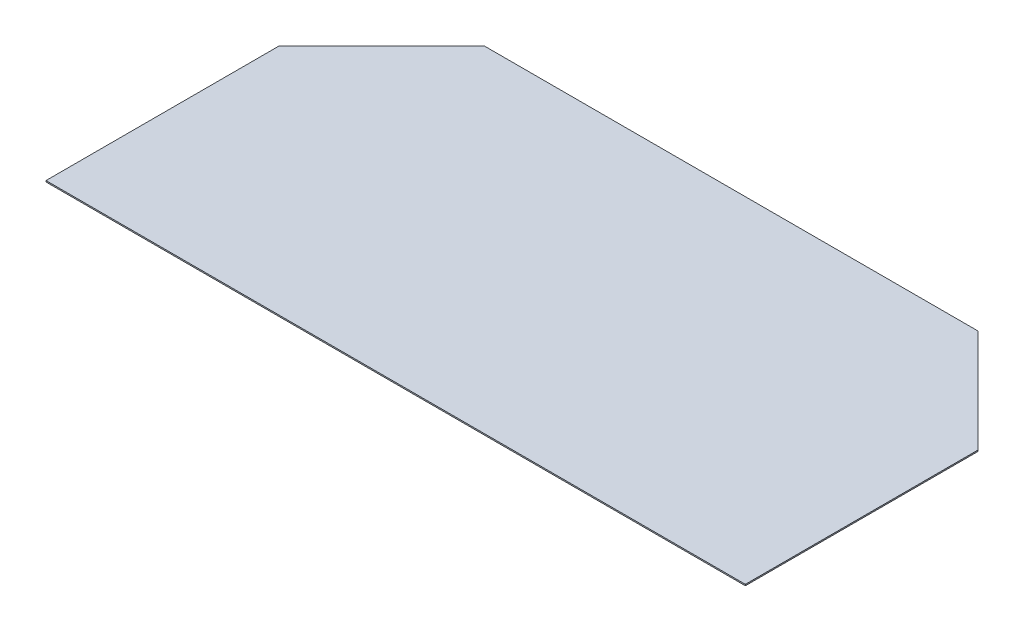
ISO-10303-21;
HEADER;
FILE_DESCRIPTION(('STEP AP214'),'2;1');
FILE_NAME('part.step','',(''),(''),'','','');
FILE_SCHEMA(('AUTOMOTIVE_DESIGN { 1 0 10303 214 1 1 1 1 }'));
ENDSEC;
DATA;
#1=APPLICATION_CONTEXT('core data for automotive mechanical design processes');
#2=APPLICATION_PROTOCOL_DEFINITION('international standard','automotive_design',2000,#1);
#3=PRODUCT_CONTEXT('',#1,'mechanical');
#4=PRODUCT('Part','Part','',(#3));
#5=PRODUCT_RELATED_PRODUCT_CATEGORY('part','',(#4));
#6=PRODUCT_DEFINITION_FORMATION('','',#4);
#7=PRODUCT_DEFINITION_CONTEXT('part definition',#1,'design');
#8=PRODUCT_DEFINITION('design','',#6,#7);
#9=PRODUCT_DEFINITION_SHAPE('','',#8);
#10=(LENGTH_UNIT() NAMED_UNIT(*) SI_UNIT(.MILLI.,.METRE.));
#11=(NAMED_UNIT(*) PLANE_ANGLE_UNIT() SI_UNIT($,.RADIAN.));
#12=(NAMED_UNIT(*) SI_UNIT($,.STERADIAN.) SOLID_ANGLE_UNIT());
#13=UNCERTAINTY_MEASURE_WITH_UNIT(LENGTH_MEASURE(1.E-05),#10,'distance_accuracy_value','');
#14=(GEOMETRIC_REPRESENTATION_CONTEXT(3) GLOBAL_UNCERTAINTY_ASSIGNED_CONTEXT((#13)) GLOBAL_UNIT_ASSIGNED_CONTEXT((#10,
#11,#12)) REPRESENTATION_CONTEXT('',''));
#15=CARTESIAN_POINT('',(0.,0.,0.));
#16=DIRECTION('',(0.,0.,1.));
#17=DIRECTION('',(1.,0.,0.));
#18=AXIS2_PLACEMENT_3D('',#15,#16,#17);
#19=CARTESIAN_POINT('',(0.,0.23,-41.58));
#20=DIRECTION('',(1.,0.,0.));
#21=DIRECTION('',(0.,0.,-1.));
#22=AXIS2_PLACEMENT_3D('',#19,#20,#21);
#23=PLANE('',#22);
#24=DIRECTION('',(0.,0.,1.));
#25=VECTOR('',#24,1.);
#26=CARTESIAN_POINT('',(0.,0.,-41.58));
#27=LINE('',#26,#25);
#28=CARTESIAN_POINT('',(0.,0.,-41.58));
#29=VERTEX_POINT('',#28);
#30=CARTESIAN_POINT('',(0.,0.,0.));
#31=VERTEX_POINT('',#30);
#32=EDGE_CURVE('E125',#29,#31,#27,.T.);
#33=ORIENTED_EDGE('',*,*,#32,.T.);
#34=DIRECTION('',(0.,-1.,0.));
#35=VECTOR('',#34,1.);
#36=CARTESIAN_POINT('',(0.,0.23,0.));
#37=LINE('',#36,#35);
#38=CARTESIAN_POINT('',(0.,0.23,0.));
#39=VERTEX_POINT('',#38);
#40=EDGE_CURVE('E11',#39,#31,#37,.T.);
#41=ORIENTED_EDGE('',*,*,#40,.F.);
#42=DIRECTION('',(0.,0.,1.));
#43=VECTOR('',#42,1.);
#44=CARTESIAN_POINT('',(0.,0.23,-41.58));
#45=LINE('',#44,#43);
#46=CARTESIAN_POINT('',(0.,0.23,-41.58));
#47=VERTEX_POINT('',#46);
#48=EDGE_CURVE('E135',#47,#39,#45,.T.);
#49=ORIENTED_EDGE('',*,*,#48,.F.);
#50=DIRECTION('',(0.,-1.,0.));
#51=VECTOR('',#50,1.);
#52=CARTESIAN_POINT('',(0.,0.23,-41.58));
#53=LINE('',#52,#51);
#54=EDGE_CURVE('E121',#47,#29,#53,.T.);
#55=ORIENTED_EDGE('',*,*,#54,.T.);
#56=EDGE_LOOP('',(#33,#41,#49,#55));
#57=FACE_BOUND('',#56,.T.);
#58=ADVANCED_FACE('F41',(#57),#23,.F.);
#59=CARTESIAN_POINT('',(0.,0.23,0.));
#60=DIRECTION('',(0.,0.,-1.));
#61=DIRECTION('',(-1.,0.,0.));
#62=AXIS2_PLACEMENT_3D('',#59,#60,#61);
#63=PLANE('',#62);
#64=DIRECTION('',(1.,0.,0.));
#65=VECTOR('',#64,1.);
#66=CARTESIAN_POINT('',(0.,0.,0.));
#67=LINE('',#66,#65);
#68=CARTESIAN_POINT('',(125.,0.,0.));
#69=VERTEX_POINT('',#68);
#70=EDGE_CURVE('E128',#31,#69,#67,.T.);
#71=ORIENTED_EDGE('',*,*,#70,.T.);
#72=DIRECTION('',(0.,-1.,0.));
#73=VECTOR('',#72,1.);
#74=CARTESIAN_POINT('',(125.,0.23,0.));
#75=LINE('',#74,#73);
#76=CARTESIAN_POINT('',(125.,0.23,0.));
#77=VERTEX_POINT('',#76);
#78=EDGE_CURVE('E49',#77,#69,#75,.T.);
#79=ORIENTED_EDGE('',*,*,#78,.F.);
#80=DIRECTION('',(1.,0.,0.));
#81=VECTOR('',#80,1.);
#82=CARTESIAN_POINT('',(0.,0.23,0.));
#83=LINE('',#82,#81);
#84=EDGE_CURVE('E94',#39,#77,#83,.T.);
#85=ORIENTED_EDGE('',*,*,#84,.F.);
#86=ORIENTED_EDGE('',*,*,#40,.T.);
#87=EDGE_LOOP('',(#71,#79,#85,#86));
#88=FACE_BOUND('',#87,.T.);
#89=ADVANCED_FACE('F159',(#88),#63,.F.);
#90=CARTESIAN_POINT('',(125.,0.23,0.));
#91=DIRECTION('',(-1.,0.,0.));
#92=DIRECTION('',(0.,0.,1.));
#93=AXIS2_PLACEMENT_3D('',#90,#91,#92);
#94=PLANE('',#93);
#95=DIRECTION('',(0.,0.,-1.));
#96=VECTOR('',#95,1.);
#97=CARTESIAN_POINT('',(125.,0.,0.));
#98=LINE('',#97,#96);
#99=CARTESIAN_POINT('',(125.,0.,-41.58));
#100=VERTEX_POINT('',#99);
#101=EDGE_CURVE('E130',#69,#100,#98,.T.);
#102=ORIENTED_EDGE('',*,*,#101,.T.);
#103=DIRECTION('',(0.,-1.,0.));
#104=VECTOR('',#103,1.);
#105=CARTESIAN_POINT('',(125.,0.23,-41.58));
#106=LINE('',#105,#104);
#107=CARTESIAN_POINT('',(125.,0.23,-41.58));
#108=VERTEX_POINT('',#107);
#109=EDGE_CURVE('E116',#108,#100,#106,.T.);
#110=ORIENTED_EDGE('',*,*,#109,.F.);
#111=DIRECTION('',(0.,0.,-1.));
#112=VECTOR('',#111,1.);
#113=CARTESIAN_POINT('',(125.,0.23,0.));
#114=LINE('',#113,#112);
#115=EDGE_CURVE('E107',#77,#108,#114,.T.);
#116=ORIENTED_EDGE('',*,*,#115,.F.);
#117=ORIENTED_EDGE('',*,*,#78,.T.);
#118=EDGE_LOOP('',(#102,#110,#116,#117));
#119=FACE_BOUND('',#118,.T.);
#120=ADVANCED_FACE('F141',(#119),#94,.F.);
#121=CARTESIAN_POINT('',(125.,0.23,-41.58));
#122=DIRECTION('',(-0.707106781186547,0.,0.707106781186548));
#123=DIRECTION('',(0.707106781186548,0.,0.707106781186547));
#124=AXIS2_PLACEMENT_3D('',#121,#122,#123);
#125=PLANE('',#124);
#126=DIRECTION('',(-0.707106781186548,0.,-0.707106781186547));
#127=VECTOR('',#126,1.);
#128=CARTESIAN_POINT('',(125.,0.,-41.58));
#129=LINE('',#128,#127);
#130=CARTESIAN_POINT('',(106.58,0.,-60.));
#131=VERTEX_POINT('',#130);
#132=EDGE_CURVE('E115',#100,#131,#129,.T.);
#133=ORIENTED_EDGE('',*,*,#132,.T.);
#134=DIRECTION('',(0.,-1.,0.));
#135=VECTOR('',#134,1.);
#136=CARTESIAN_POINT('',(106.58,0.23,-60.));
#137=LINE('',#136,#135);
#138=CARTESIAN_POINT('',(106.58,0.23,-60.));
#139=VERTEX_POINT('',#138);
#140=EDGE_CURVE('E112',#139,#131,#137,.T.);
#141=ORIENTED_EDGE('',*,*,#140,.F.);
#142=DIRECTION('',(-0.707106781186548,0.,-0.707106781186547));
#143=VECTOR('',#142,1.);
#144=CARTESIAN_POINT('',(125.,0.23,-41.58));
#145=LINE('',#144,#143);
#146=EDGE_CURVE('E101',#108,#139,#145,.T.);
#147=ORIENTED_EDGE('',*,*,#146,.F.);
#148=ORIENTED_EDGE('',*,*,#109,.T.);
#149=EDGE_LOOP('',(#133,#141,#147,#148));
#150=FACE_BOUND('',#149,.T.);
#151=ADVANCED_FACE('F113',(#150),#125,.F.);
#152=CARTESIAN_POINT('',(106.58,0.23,-60.));
#153=DIRECTION('',(0.,0.,1.));
#154=DIRECTION('',(1.,0.,0.));
#155=AXIS2_PLACEMENT_3D('',#152,#153,#154);
#156=PLANE('',#155);
#157=DIRECTION('',(-1.,0.,0.));
#158=VECTOR('',#157,1.);
#159=CARTESIAN_POINT('',(106.58,0.,-60.));
#160=LINE('',#159,#158);
#161=CARTESIAN_POINT('',(18.42,0.,-60.));
#162=VERTEX_POINT('',#161);
#163=EDGE_CURVE('E80',#131,#162,#160,.T.);
#164=ORIENTED_EDGE('',*,*,#163,.T.);
#165=DIRECTION('',(0.,-1.,0.));
#166=VECTOR('',#165,1.);
#167=CARTESIAN_POINT('',(18.42,0.23,-60.));
#168=LINE('',#167,#166);
#169=CARTESIAN_POINT('',(18.42,0.23,-60.));
#170=VERTEX_POINT('',#169);
#171=EDGE_CURVE('E117',#170,#162,#168,.T.);
#172=ORIENTED_EDGE('',*,*,#171,.F.);
#173=DIRECTION('',(-1.,0.,0.));
#174=VECTOR('',#173,1.);
#175=CARTESIAN_POINT('',(106.58,0.23,-60.));
#176=LINE('',#175,#174);
#177=EDGE_CURVE('E105',#139,#170,#176,.T.);
#178=ORIENTED_EDGE('',*,*,#177,.F.);
#179=ORIENTED_EDGE('',*,*,#140,.T.);
#180=EDGE_LOOP('',(#164,#172,#178,#179));
#181=FACE_BOUND('',#180,.T.);
#182=ADVANCED_FACE('F119',(#181),#156,.F.);
#183=CARTESIAN_POINT('',(18.42,0.23,-60.));
#184=DIRECTION('',(0.707106781186548,0.,0.707106781186547));
#185=DIRECTION('',(0.707106781186547,0.,-0.707106781186548));
#186=AXIS2_PLACEMENT_3D('',#183,#184,#185);
#187=PLANE('',#186);
#188=DIRECTION('',(-0.707106781186547,0.,0.707106781186548));
#189=VECTOR('',#188,1.);
#190=CARTESIAN_POINT('',(18.42,0.,-60.));
#191=LINE('',#190,#189);
#192=EDGE_CURVE('E86',#162,#29,#191,.T.);
#193=ORIENTED_EDGE('',*,*,#192,.T.);
#194=ORIENTED_EDGE('',*,*,#54,.F.);
#195=DIRECTION('',(-0.707106781186547,0.,0.707106781186548));
#196=VECTOR('',#195,1.);
#197=CARTESIAN_POINT('',(18.42,0.23,-60.));
#198=LINE('',#197,#196);
#199=EDGE_CURVE('E57',#170,#47,#198,.T.);
#200=ORIENTED_EDGE('',*,*,#199,.F.);
#201=ORIENTED_EDGE('',*,*,#171,.T.);
#202=EDGE_LOOP('',(#193,#194,#200,#201));
#203=FACE_BOUND('',#202,.T.);
#204=ADVANCED_FACE('F148',(#203),#187,.F.);
#205=CARTESIAN_POINT('',(0.,0.23,0.));
#206=DIRECTION('',(0.,1.,0.));
#207=DIRECTION('',(0.,0.,1.));
#208=AXIS2_PLACEMENT_3D('',#205,#206,#207);
#209=PLANE('',#208);
#210=ORIENTED_EDGE('',*,*,#48,.T.);
#211=ORIENTED_EDGE('',*,*,#84,.T.);
#212=ORIENTED_EDGE('',*,*,#115,.T.);
#213=ORIENTED_EDGE('',*,*,#146,.T.);
#214=ORIENTED_EDGE('',*,*,#177,.T.);
#215=ORIENTED_EDGE('',*,*,#199,.T.);
#216=EDGE_LOOP('',(#210,#211,#212,#213,#214,#215));
#217=FACE_BOUND('',#216,.T.);
#218=ADVANCED_FACE('F103',(#217),#209,.T.);
#219=CARTESIAN_POINT('',(0.,0.,0.));
#220=DIRECTION('',(0.,1.,0.));
#221=DIRECTION('',(0.,0.,1.));
#222=AXIS2_PLACEMENT_3D('',#219,#220,#221);
#223=PLANE('',#222);
#224=ORIENTED_EDGE('',*,*,#32,.F.);
#225=ORIENTED_EDGE('',*,*,#192,.F.);
#226=ORIENTED_EDGE('',*,*,#163,.F.);
#227=ORIENTED_EDGE('',*,*,#132,.F.);
#228=ORIENTED_EDGE('',*,*,#101,.F.);
#229=ORIENTED_EDGE('',*,*,#70,.F.);
#230=EDGE_LOOP('',(#224,#225,#226,#227,#228,#229));
#231=FACE_BOUND('',#230,.T.);
#232=ADVANCED_FACE('F144',(#231),#223,.F.);
#233=CLOSED_SHELL('',(#58,#89,#120,#151,#182,#204,#218,#232));
#234=MANIFOLD_SOLID_BREP('B2',#233);
#235=ADVANCED_BREP_SHAPE_REPRESENTATION('',(#18,#234),#14);
#236=SHAPE_DEFINITION_REPRESENTATION(#9,#235);
ENDSEC;
END-ISO-10303-21;
